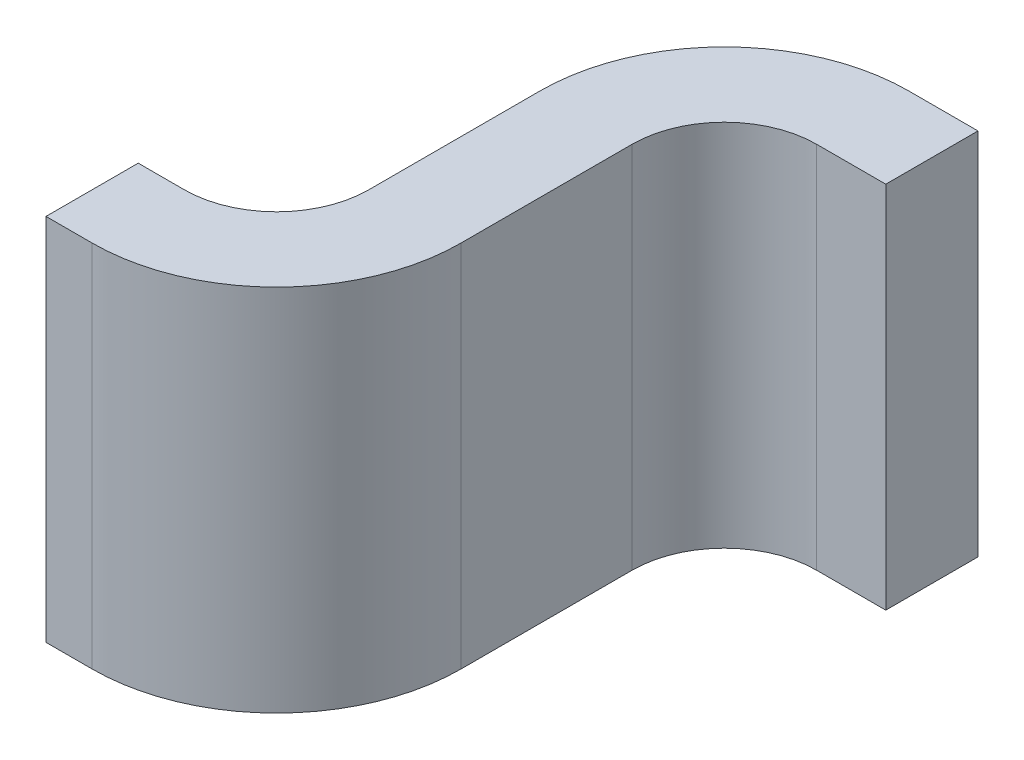
ISO-10303-21;
HEADER;
FILE_DESCRIPTION(('STEP AP214'),'2;1');
FILE_NAME('part.step','',(''),(''),'','','');
FILE_SCHEMA(('AUTOMOTIVE_DESIGN { 1 0 10303 214 1 1 1 1 }'));
ENDSEC;
DATA;
#1=APPLICATION_CONTEXT('core data for automotive mechanical design processes');
#2=APPLICATION_PROTOCOL_DEFINITION('international standard','automotive_design',2000,#1);
#3=PRODUCT_CONTEXT('',#1,'mechanical');
#4=PRODUCT('Part','Part','',(#3));
#5=PRODUCT_RELATED_PRODUCT_CATEGORY('part','',(#4));
#6=PRODUCT_DEFINITION_FORMATION('','',#4);
#7=PRODUCT_DEFINITION_CONTEXT('part definition',#1,'design');
#8=PRODUCT_DEFINITION('design','',#6,#7);
#9=PRODUCT_DEFINITION_SHAPE('','',#8);
#10=(LENGTH_UNIT() NAMED_UNIT(*) SI_UNIT(.MILLI.,.METRE.));
#11=(NAMED_UNIT(*) PLANE_ANGLE_UNIT() SI_UNIT($,.RADIAN.));
#12=(NAMED_UNIT(*) SI_UNIT($,.STERADIAN.) SOLID_ANGLE_UNIT());
#13=UNCERTAINTY_MEASURE_WITH_UNIT(LENGTH_MEASURE(1.E-05),#10,'distance_accuracy_value','');
#14=(GEOMETRIC_REPRESENTATION_CONTEXT(3) GLOBAL_UNCERTAINTY_ASSIGNED_CONTEXT((#13)) GLOBAL_UNIT_ASSIGNED_CONTEXT((#10,
#11,#12)) REPRESENTATION_CONTEXT('',''));
#15=CARTESIAN_POINT('',(0.,0.,0.));
#16=DIRECTION('',(0.,0.,1.));
#17=DIRECTION('',(1.,0.,0.));
#18=AXIS2_PLACEMENT_3D('',#15,#16,#17);
#19=CARTESIAN_POINT('',(9.95008326334,12.94991541666,-1.611602028607));
#20=DIRECTION('',(0.,8.74227765734797E-08,-0.999999999999996));
#21=DIRECTION('',(0.,0.999999999999996,8.74227765734797E-08));
#22=AXIS2_PLACEMENT_3D('',#19,#20,#21);
#23=PLANE('',#22);
#24=DIRECTION('',(1.,0.,0.));
#25=VECTOR('',#24,1.);
#26=CARTESIAN_POINT('',(9.95008326334,12.9499154166597,-1.611602028607));
#27=LINE('',#26,#25);
#28=CARTESIAN_POINT('',(9.90008326334,12.9499154166599,-1.61160200529433));
#29=VERTEX_POINT('',#28);
#30=CARTESIAN_POINT('',(9.95008326334,12.9499154166599,-1.611602028607));
#31=VERTEX_POINT('',#30);
#32=EDGE_CURVE('E156',#29,#31,#27,.T.);
#33=ORIENTED_EDGE('',*,*,#32,.T.);
#34=DIRECTION('',(0.,-0.999999999999996,-8.74227765734797E-08));
#35=VECTOR('',#34,1.);
#36=CARTESIAN_POINT('',(9.95008326334,12.9499154166604,-1.611602028607));
#37=LINE('',#36,#35);
#38=CARTESIAN_POINT('',(9.95008326334,13.3499154166602,-1.61160199363792));
#39=VERTEX_POINT('',#38);
#40=EDGE_CURVE('E91',#39,#31,#37,.T.);
#41=ORIENTED_EDGE('',*,*,#40,.F.);
#42=DIRECTION('',(1.,0.,0.));
#43=VECTOR('',#42,1.);
#44=CARTESIAN_POINT('',(9.95008326334,13.34991541666,-1.611601993638));
#45=LINE('',#44,#43);
#46=CARTESIAN_POINT('',(9.90008326334,13.34991541666,-1.611601993638));
#47=VERTEX_POINT('',#46);
#48=EDGE_CURVE('E139',#39,#47,#45,.F.);
#49=ORIENTED_EDGE('',*,*,#48,.T.);
#50=DIRECTION('',(0.,1.,0.));
#51=VECTOR('',#50,1.);
#52=CARTESIAN_POINT('',(9.90008326334,12.94991541666,-1.611601993638));
#53=LINE('',#52,#51);
#54=EDGE_CURVE('E142',#47,#29,#53,.F.);
#55=ORIENTED_EDGE('',*,*,#54,.T.);
#56=EDGE_LOOP('',(#33,#41,#49,#55));
#57=FACE_BOUND('',#56,.T.);
#58=ADVANCED_FACE('F17',(#57),#23,.F.);
#59=CARTESIAN_POINT('',(9.90008326334,12.94991541666,-1.611602028607));
#60=DIRECTION('',(1.,0.,0.));
#61=DIRECTION('',(0.,1.,0.));
#62=AXIS2_PLACEMENT_3D('',#59,#60,#61);
#63=PLANE('',#62);
#64=DIRECTION('',(0.,8.74227765734797E-08,-0.999999999999996));
#65=VECTOR('',#64,1.);
#66=CARTESIAN_POINT('',(9.90008326334,13.34991541666,-1.611601993638));
#67=LINE('',#66,#65);
#68=CARTESIAN_POINT('',(9.90008326334,13.3499154254021,-1.711601993638));
#69=VERTEX_POINT('',#68);
#70=EDGE_CURVE('E138',#47,#69,#67,.T.);
#71=ORIENTED_EDGE('',*,*,#70,.T.);
#72=DIRECTION('',(0.,-0.999999999999996,-8.74227765734797E-08));
#73=VECTOR('',#72,1.);
#74=CARTESIAN_POINT('',(9.90008326334,13.349915425402,-1.711601993638));
#75=LINE('',#74,#73);
#76=CARTESIAN_POINT('',(9.90008326334,12.949915421031,-1.71160202860711));
#77=VERTEX_POINT('',#76);
#78=EDGE_CURVE('E128',#69,#77,#75,.T.);
#79=ORIENTED_EDGE('',*,*,#78,.T.);
#80=DIRECTION('',(0.,0.,1.));
#81=VECTOR('',#80,1.);
#82=CARTESIAN_POINT('',(9.90008326334,12.94991541666,-1.611602028607));
#83=LINE('',#82,#81);
#84=EDGE_CURVE('E153',#29,#77,#83,.F.);
#85=ORIENTED_EDGE('',*,*,#84,.F.);
#86=ORIENTED_EDGE('',*,*,#54,.F.);
#87=EDGE_LOOP('',(#71,#79,#85,#86));
#88=FACE_BOUND('',#87,.T.);
#89=ADVANCED_FACE('F192',(#88),#63,.F.);
#90=CARTESIAN_POINT('',(9.95008326334,12.949915434145,-1.811602028607));
#91=DIRECTION('',(0.,-0.999999999999996,-8.74227765734797E-08));
#92=DIRECTION('',(0.,8.74227765734797E-08,-0.999999999999996));
#93=AXIS2_PLACEMENT_3D('',#90,#91,#92);
#94=CYLINDRICAL_SURFACE('',#93,0.2);
#95=CARTESIAN_POINT('',(9.95008326334,12.9499154341446,-1.811602028607));
#96=DIRECTION('',(0.,-0.999999999999996,-8.74227765734797E-08));
#97=DIRECTION('',(0.,8.74227765734797E-08,-0.999999999999996));
#98=AXIS2_PLACEMENT_3D('',#95,#96,#97);
#99=CIRCLE('',#98,0.2);
#100=CARTESIAN_POINT('',(10.15008326334,12.9499154341448,-1.811602028607));
#101=VERTEX_POINT('',#100);
#102=EDGE_CURVE('E20',#101,#31,#99,.T.);
#103=ORIENTED_EDGE('',*,*,#102,.F.);
#104=DIRECTION('',(0.,-1.,0.));
#105=VECTOR('',#104,1.);
#106=CARTESIAN_POINT('',(10.15008326334,12.949915450362,-1.811602028607));
#107=LINE('',#106,#105);
#108=CARTESIAN_POINT('',(10.15008326334,13.349915434145,-1.81160201112244));
#109=VERTEX_POINT('',#108);
#110=EDGE_CURVE('E89',#101,#109,#107,.F.);
#111=ORIENTED_EDGE('',*,*,#110,.T.);
#112=CARTESIAN_POINT('',(9.95008326334,13.349915434145,-1.81160199363789));
#113=DIRECTION('',(0.,-0.999999999999996,-8.74227765734797E-08));
#114=DIRECTION('',(0.,8.74227765734797E-08,-0.999999999999996));
#115=AXIS2_PLACEMENT_3D('',#112,#113,#114);
#116=CIRCLE('',#115,0.2);
#117=EDGE_CURVE('E103',#39,#109,#116,.F.);
#118=ORIENTED_EDGE('',*,*,#117,.F.);
#119=ORIENTED_EDGE('',*,*,#40,.T.);
#120=EDGE_LOOP('',(#103,#111,#118,#119));
#121=FACE_BOUND('',#120,.T.);
#122=ADVANCED_FACE('F87',(#121),#94,.T.);
#123=CARTESIAN_POINT('',(9.95008326334,13.349915425402,-1.711601993638));
#124=DIRECTION('',(0.,-8.74227765734797E-08,0.999999999999996));
#125=DIRECTION('',(0.,-0.999999999999996,-8.74227765734797E-08));
#126=AXIS2_PLACEMENT_3D('',#123,#124,#125);
#127=PLANE('',#126);
#128=DIRECTION('',(1.,0.,0.));
#129=VECTOR('',#128,1.);
#130=CARTESIAN_POINT('',(9.95008326334,13.349915425402,-1.711601993638));
#131=LINE('',#130,#129);
#132=CARTESIAN_POINT('',(9.95008326334,13.3499154254024,-1.711601993638));
#133=VERTEX_POINT('',#132);
#134=EDGE_CURVE('E125',#133,#69,#131,.F.);
#135=ORIENTED_EDGE('',*,*,#134,.F.);
#136=DIRECTION('',(0.,-0.999999999999996,-8.74227765734797E-08));
#137=VECTOR('',#136,1.);
#138=CARTESIAN_POINT('',(9.95008326334,13.3499154254027,-1.711601993638));
#139=LINE('',#138,#137);
#140=CARTESIAN_POINT('',(9.95008326334,12.9499154254022,-1.71160202860711));
#141=VERTEX_POINT('',#140);
#142=EDGE_CURVE('E131',#133,#141,#139,.T.);
#143=ORIENTED_EDGE('',*,*,#142,.T.);
#144=DIRECTION('',(1.,0.,0.));
#145=VECTOR('',#144,1.);
#146=CARTESIAN_POINT('',(9.95008326334,12.949915425402,-1.71160202860711));
#147=LINE('',#146,#145);
#148=EDGE_CURVE('E95',#77,#141,#147,.T.);
#149=ORIENTED_EDGE('',*,*,#148,.F.);
#150=ORIENTED_EDGE('',*,*,#78,.F.);
#151=EDGE_LOOP('',(#135,#143,#149,#150));
#152=FACE_BOUND('',#151,.T.);
#153=ADVANCED_FACE('F343',(#152),#127,.F.);
#154=CARTESIAN_POINT('',(10.15008326334,12.949915450362,-1.997102028607));
#155=DIRECTION('',(-1.,0.,0.));
#156=DIRECTION('',(0.,-1.,0.));
#157=AXIS2_PLACEMENT_3D('',#154,#155,#156);
#158=PLANE('',#157);
#159=DIRECTION('',(0.,-8.74227765734797E-08,0.999999999999996));
#160=VECTOR('',#159,1.);
#161=CARTESIAN_POINT('',(10.15008326334,12.949915450362,-1.997102028607));
#162=LINE('',#161,#160);
#163=CARTESIAN_POINT('',(10.15008326334,12.9499154503617,-1.997102028607));
#164=VERTEX_POINT('',#163);
#165=EDGE_CURVE('E98',#101,#164,#162,.F.);
#166=ORIENTED_EDGE('',*,*,#165,.T.);
#167=DIRECTION('',(0.,0.999999999999996,8.74227765734797E-08));
#168=VECTOR('',#167,1.);
#169=CARTESIAN_POINT('',(10.15008326334,12.949915450362,-1.997102028607));
#170=LINE('',#169,#168);
#171=CARTESIAN_POINT('',(10.15008326334,13.3499154503617,-1.99710199363792));
#172=VERTEX_POINT('',#171);
#173=EDGE_CURVE('E241',#164,#172,#170,.T.);
#174=ORIENTED_EDGE('',*,*,#173,.T.);
#175=DIRECTION('',(0.,8.74227765734797E-08,-0.999999999999996));
#176=VECTOR('',#175,1.);
#177=CARTESIAN_POINT('',(10.15008326334,13.349915450362,-1.997101993638));
#178=LINE('',#177,#176);
#179=EDGE_CURVE('E101',#172,#109,#178,.F.);
#180=ORIENTED_EDGE('',*,*,#179,.T.);
#181=ORIENTED_EDGE('',*,*,#110,.F.);
#182=EDGE_LOOP('',(#166,#174,#180,#181));
#183=FACE_BOUND('',#182,.T.);
#184=ADVANCED_FACE('F97',(#183),#158,.F.);
#185=CARTESIAN_POINT('',(10.32508326334,12.949915459104,-2.097102028607));
#186=DIRECTION('',(0.,8.74227765734797E-08,-0.999999999999996));
#187=DIRECTION('',(0.,0.999999999999996,8.74227765734797E-08));
#188=AXIS2_PLACEMENT_3D('',#185,#186,#187);
#189=PLANE('',#188);
#190=DIRECTION('',(1.,0.,0.));
#191=VECTOR('',#190,1.);
#192=CARTESIAN_POINT('',(10.32508326334,12.9499154591037,-2.097102028607));
#193=LINE('',#192,#191);
#194=CARTESIAN_POINT('',(10.25008326334,12.9499154591038,-2.097102028607));
#195=VERTEX_POINT('',#194);
#196=CARTESIAN_POINT('',(10.32508326334,12.9499154591039,-2.09710200529433));
#197=VERTEX_POINT('',#196);
#198=EDGE_CURVE('E235',#195,#197,#193,.T.);
#199=ORIENTED_EDGE('',*,*,#198,.T.);
#200=DIRECTION('',(0.,1.,0.));
#201=VECTOR('',#200,1.);
#202=CARTESIAN_POINT('',(10.32508326334,12.949915459104,-2.097101993638));
#203=LINE('',#202,#201);
#204=CARTESIAN_POINT('',(10.32508326334,13.349915462018,-2.097101993638));
#205=VERTEX_POINT('',#204);
#206=EDGE_CURVE('E118',#205,#197,#203,.F.);
#207=ORIENTED_EDGE('',*,*,#206,.F.);
#208=DIRECTION('',(1.,0.,0.));
#209=VECTOR('',#208,1.);
#210=CARTESIAN_POINT('',(10.32508326334,13.349915459104,-2.097101993638));
#211=LINE('',#210,#209);
#212=CARTESIAN_POINT('',(10.25008326334,13.349915459104,-2.09710199363795));
#213=VERTEX_POINT('',#212);
#214=EDGE_CURVE('E180',#205,#213,#211,.F.);
#215=ORIENTED_EDGE('',*,*,#214,.T.);
#216=DIRECTION('',(0.,0.999999999999996,8.74227765734797E-08));
#217=VECTOR('',#216,1.);
#218=CARTESIAN_POINT('',(10.25008326334,12.9499154591043,-2.097102028607));
#219=LINE('',#218,#217);
#220=EDGE_CURVE('E243',#213,#195,#219,.F.);
#221=ORIENTED_EDGE('',*,*,#220,.T.);
#222=EDGE_LOOP('',(#199,#207,#215,#221));
#223=FACE_BOUND('',#222,.T.);
#224=ADVANCED_FACE('F248',(#223),#189,.F.);
#225=CARTESIAN_POINT('',(9.95008326334,13.349915434145,-1.811601993638));
#226=DIRECTION('',(0.,-0.999999999999996,-8.74227765734797E-08));
#227=DIRECTION('',(0.,8.74227765734797E-08,-0.999999999999996));
#228=AXIS2_PLACEMENT_3D('',#225,#226,#227);
#229=CYLINDRICAL_SURFACE('',#228,0.1);
#230=CARTESIAN_POINT('',(9.95008326334,13.349915434145,-1.811601993638));
#231=DIRECTION('',(0.,-0.999999999999996,-8.74227765734797E-08));
#232=DIRECTION('',(0.,8.74227765734797E-08,-0.999999999999996));
#233=AXIS2_PLACEMENT_3D('',#230,#231,#232);
#234=CIRCLE('',#233,0.1);
#235=CARTESIAN_POINT('',(10.05008326334,13.3499154422535,-1.811601993638));
#236=VERTEX_POINT('',#235);
#237=EDGE_CURVE('E112',#236,#133,#234,.T.);
#238=ORIENTED_EDGE('',*,*,#237,.F.);
#239=DIRECTION('',(0.,1.,0.));
#240=VECTOR('',#239,1.);
#241=CARTESIAN_POINT('',(10.05008326334,13.349915450362,-1.811601993638));
#242=LINE('',#241,#240);
#243=CARTESIAN_POINT('',(10.05008326334,12.9499154341443,-1.81160201112256));
#244=VERTEX_POINT('',#243);
#245=EDGE_CURVE('E177',#236,#244,#242,.F.);
#246=ORIENTED_EDGE('',*,*,#245,.T.);
#247=CARTESIAN_POINT('',(9.95008326334,12.9499154341443,-1.81160202860711));
#248=DIRECTION('',(0.,-0.999999999999996,-8.74227765734797E-08));
#249=DIRECTION('',(0.,8.74227765734797E-08,-0.999999999999996));
#250=AXIS2_PLACEMENT_3D('',#247,#248,#249);
#251=CIRCLE('',#250,0.1);
#252=EDGE_CURVE('E110',#141,#244,#251,.F.);
#253=ORIENTED_EDGE('',*,*,#252,.F.);
#254=ORIENTED_EDGE('',*,*,#142,.F.);
#255=EDGE_LOOP('',(#238,#246,#253,#254));
#256=FACE_BOUND('',#255,.T.);
#257=ADVANCED_FACE('F260',(#256),#229,.F.);
#258=CARTESIAN_POINT('',(10.25008326334,12.949915450362,-1.997102028607));
#259=DIRECTION('',(0.,0.999999999999996,8.74227765734797E-08));
#260=DIRECTION('',(0.,-8.74227765734797E-08,0.999999999999996));
#261=AXIS2_PLACEMENT_3D('',#258,#259,#260);
#262=CYLINDRICAL_SURFACE('',#261,0.1);
#263=CARTESIAN_POINT('',(10.25008326334,12.9499154503617,-1.997102028607));
#264=DIRECTION('',(0.,0.999999999999996,8.74227765734797E-08));
#265=DIRECTION('',(0.,-8.74227765734797E-08,0.999999999999996));
#266=AXIS2_PLACEMENT_3D('',#263,#264,#265);
#267=CIRCLE('',#266,0.1);
#268=EDGE_CURVE('E109',#195,#164,#267,.T.);
#269=ORIENTED_EDGE('',*,*,#268,.F.);
#270=ORIENTED_EDGE('',*,*,#220,.F.);
#271=CARTESIAN_POINT('',(10.25008326334,13.349915450362,-1.99710199363789));
#272=DIRECTION('',(0.,0.999999999999996,8.74227765734797E-08));
#273=DIRECTION('',(0.,-8.74227765734797E-08,0.999999999999996));
#274=AXIS2_PLACEMENT_3D('',#271,#272,#273);
#275=CIRCLE('',#274,0.1);
#276=EDGE_CURVE('E173',#172,#213,#275,.F.);
#277=ORIENTED_EDGE('',*,*,#276,.F.);
#278=ORIENTED_EDGE('',*,*,#173,.F.);
#279=EDGE_LOOP('',(#269,#270,#277,#278));
#280=FACE_BOUND('',#279,.T.);
#281=ADVANCED_FACE('F309',(#280),#262,.F.);
#282=CARTESIAN_POINT('',(10.32508326334,12.949915459104,-2.097102028607));
#283=DIRECTION('',(1.,0.,0.));
#284=DIRECTION('',(0.,1.,0.));
#285=AXIS2_PLACEMENT_3D('',#282,#283,#284);
#286=PLANE('',#285);
#287=DIRECTION('',(0.,8.74227765734797E-08,-0.999999999999996));
#288=VECTOR('',#287,1.);
#289=CARTESIAN_POINT('',(10.32508326334,13.349915459104,-2.097101993638));
#290=LINE('',#289,#288);
#291=CARTESIAN_POINT('',(10.32508326334,13.3499154678461,-2.197101993638));
#292=VERTEX_POINT('',#291);
#293=EDGE_CURVE('E121',#292,#205,#290,.F.);
#294=ORIENTED_EDGE('',*,*,#293,.T.);
#295=ORIENTED_EDGE('',*,*,#206,.T.);
#296=DIRECTION('',(0.,0.,1.));
#297=VECTOR('',#296,1.);
#298=CARTESIAN_POINT('',(10.32508326334,12.949915459104,-2.097102028607));
#299=LINE('',#298,#297);
#300=CARTESIAN_POINT('',(10.32508326334,12.949915464932,-2.19710202860711));
#301=VERTEX_POINT('',#300);
#302=EDGE_CURVE('E122',#197,#301,#299,.F.);
#303=ORIENTED_EDGE('',*,*,#302,.T.);
#304=DIRECTION('',(0.,-0.999999999999996,-8.74227765734797E-08));
#305=VECTOR('',#304,1.);
#306=CARTESIAN_POINT('',(10.32508326334,13.349915467846,-2.197101993638));
#307=LINE('',#306,#305);
#308=EDGE_CURVE('E210',#301,#292,#307,.F.);
#309=ORIENTED_EDGE('',*,*,#308,.T.);
#310=EDGE_LOOP('',(#294,#295,#303,#309));
#311=FACE_BOUND('',#310,.T.);
#312=ADVANCED_FACE('F211',(#311),#286,.T.);
#313=CARTESIAN_POINT('',(10.144017246162,12.949915459634,-2.103168045785));
#314=DIRECTION('',(0.,-0.999999999999996,-8.74227765734797E-08));
#315=DIRECTION('',(0.,8.74227765734797E-08,-0.999999999999996));
#316=AXIS2_PLACEMENT_3D('',#313,#314,#315);
#317=PLANE('',#316);
#318=CARTESIAN_POINT('',(10.25008326334,12.9499154503614,-1.99710202860711));
#319=DIRECTION('',(0.,0.999999999999996,8.74227765734797E-08));
#320=DIRECTION('',(0.,-8.74227765734797E-08,0.999999999999996));
#321=AXIS2_PLACEMENT_3D('',#318,#319,#320);
#322=CIRCLE('',#321,0.2);
#323=CARTESIAN_POINT('',(10.25008326334,12.949915467846,-2.19710202860711));
#324=VERTEX_POINT('',#323);
#325=CARTESIAN_POINT('',(10.05008326334,12.9499154422532,-1.997102028607));
#326=VERTEX_POINT('',#325);
#327=EDGE_CURVE('E170',#324,#326,#322,.T.);
#328=ORIENTED_EDGE('',*,*,#327,.F.);
#329=DIRECTION('',(1.,0.,0.));
#330=VECTOR('',#329,1.);
#331=CARTESIAN_POINT('',(10.32508326334,12.949915467846,-2.19710202860711));
#332=LINE('',#331,#330);
#333=EDGE_CURVE('E176',#324,#301,#332,.T.);
#334=ORIENTED_EDGE('',*,*,#333,.T.);
#335=ORIENTED_EDGE('',*,*,#302,.F.);
#336=ORIENTED_EDGE('',*,*,#198,.F.);
#337=ORIENTED_EDGE('',*,*,#268,.T.);
#338=ORIENTED_EDGE('',*,*,#165,.F.);
#339=ORIENTED_EDGE('',*,*,#102,.T.);
#340=ORIENTED_EDGE('',*,*,#32,.F.);
#341=ORIENTED_EDGE('',*,*,#84,.T.);
#342=ORIENTED_EDGE('',*,*,#148,.T.);
#343=ORIENTED_EDGE('',*,*,#252,.T.);
#344=DIRECTION('',(0.,0.,1.));
#345=VECTOR('',#344,1.);
#346=CARTESIAN_POINT('',(10.05008326334,12.949915434145,-1.997101993638));
#347=LINE('',#346,#345);
#348=EDGE_CURVE('E179',#244,#326,#347,.F.);
#349=ORIENTED_EDGE('',*,*,#348,.T.);
#350=EDGE_LOOP('',(#328,#334,#335,#336,#337,#338,#339,#340,#341,#342,#343,#349));
#351=FACE_BOUND('',#350,.T.);
#352=ADVANCED_FACE('F106',(#351),#317,.T.);
#353=CARTESIAN_POINT('',(10.05008326334,13.349915450362,-1.997101993638));
#354=DIRECTION('',(1.,0.,0.));
#355=DIRECTION('',(0.,1.,0.));
#356=AXIS2_PLACEMENT_3D('',#353,#354,#355);
#357=PLANE('',#356);
#358=DIRECTION('',(0.,0.,1.));
#359=VECTOR('',#358,1.);
#360=CARTESIAN_POINT('',(10.05008326334,13.349915450362,-1.997101993638));
#361=LINE('',#360,#359);
#362=CARTESIAN_POINT('',(10.05008326334,13.349915450362,-1.99710201112244));
#363=VERTEX_POINT('',#362);
#364=EDGE_CURVE('E224',#363,#236,#361,.T.);
#365=ORIENTED_EDGE('',*,*,#364,.F.);
#366=DIRECTION('',(0.,0.999999999999996,8.74227765734797E-08));
#367=VECTOR('',#366,1.);
#368=CARTESIAN_POINT('',(10.05008326334,13.349915450362,-1.99710199363789));
#369=LINE('',#368,#367);
#370=EDGE_CURVE('E169',#326,#363,#369,.T.);
#371=ORIENTED_EDGE('',*,*,#370,.F.);
#372=ORIENTED_EDGE('',*,*,#348,.F.);
#373=ORIENTED_EDGE('',*,*,#245,.F.);
#374=EDGE_LOOP('',(#365,#371,#372,#373));
#375=FACE_BOUND('',#374,.T.);
#376=ADVANCED_FACE('F263',(#375),#357,.F.);
#377=CARTESIAN_POINT('',(10.144017246162,13.349915459634,-2.103168010816));
#378=DIRECTION('',(0.,0.999999999999996,8.74227765734797E-08));
#379=DIRECTION('',(0.,-8.74227765734797E-08,0.999999999999996));
#380=AXIS2_PLACEMENT_3D('',#377,#378,#379);
#381=PLANE('',#380);
#382=ORIENTED_EDGE('',*,*,#276,.T.);
#383=ORIENTED_EDGE('',*,*,#214,.F.);
#384=ORIENTED_EDGE('',*,*,#293,.F.);
#385=DIRECTION('',(1.,0.,0.));
#386=VECTOR('',#385,1.);
#387=CARTESIAN_POINT('',(10.32508326334,13.349915467846,-2.197101993638));
#388=LINE('',#387,#386);
#389=CARTESIAN_POINT('',(10.25008326334,13.3499154678463,-2.197101993638));
#390=VERTEX_POINT('',#389);
#391=EDGE_CURVE('E35',#292,#390,#388,.F.);
#392=ORIENTED_EDGE('',*,*,#391,.T.);
#393=CARTESIAN_POINT('',(10.25008326334,13.349915450362,-1.997101993638));
#394=DIRECTION('',(0.,0.999999999999996,8.74227765734797E-08));
#395=DIRECTION('',(0.,-8.74227765734797E-08,0.999999999999996));
#396=AXIS2_PLACEMENT_3D('',#393,#394,#395);
#397=CIRCLE('',#396,0.2);
#398=EDGE_CURVE('E26',#363,#390,#397,.F.);
#399=ORIENTED_EDGE('',*,*,#398,.F.);
#400=ORIENTED_EDGE('',*,*,#364,.T.);
#401=ORIENTED_EDGE('',*,*,#237,.T.);
#402=ORIENTED_EDGE('',*,*,#134,.T.);
#403=ORIENTED_EDGE('',*,*,#70,.F.);
#404=ORIENTED_EDGE('',*,*,#48,.F.);
#405=ORIENTED_EDGE('',*,*,#117,.T.);
#406=ORIENTED_EDGE('',*,*,#179,.F.);
#407=EDGE_LOOP('',(#382,#383,#384,#392,#399,#400,#401,#402,#403,#404,#405,#406));
#408=FACE_BOUND('',#407,.T.);
#409=ADVANCED_FACE('F182',(#408),#381,.T.);
#410=CARTESIAN_POINT('',(10.32508326334,13.349915467846,-2.197101993638));
#411=DIRECTION('',(0.,-8.74227765734797E-08,0.999999999999996));
#412=DIRECTION('',(0.,-0.999999999999996,-8.74227765734797E-08));
#413=AXIS2_PLACEMENT_3D('',#410,#411,#412);
#414=PLANE('',#413);
#415=ORIENTED_EDGE('',*,*,#391,.F.);
#416=ORIENTED_EDGE('',*,*,#308,.F.);
#417=ORIENTED_EDGE('',*,*,#333,.F.);
#418=DIRECTION('',(0.,0.999999999999996,8.74227765734797E-08));
#419=VECTOR('',#418,1.);
#420=CARTESIAN_POINT('',(10.25008326334,13.3499154678466,-2.197101993638));
#421=LINE('',#420,#419);
#422=EDGE_CURVE('E11',#390,#324,#421,.F.);
#423=ORIENTED_EDGE('',*,*,#422,.F.);
#424=EDGE_LOOP('',(#415,#416,#417,#423));
#425=FACE_BOUND('',#424,.T.);
#426=ADVANCED_FACE('F218',(#425),#414,.F.);
#427=CARTESIAN_POINT('',(10.25008326334,13.349915450362,-1.997101993638));
#428=DIRECTION('',(0.,0.999999999999996,8.74227765734797E-08));
#429=DIRECTION('',(0.,-8.74227765734797E-08,0.999999999999996));
#430=AXIS2_PLACEMENT_3D('',#427,#428,#429);
#431=CYLINDRICAL_SURFACE('',#430,0.2);
#432=ORIENTED_EDGE('',*,*,#398,.T.);
#433=ORIENTED_EDGE('',*,*,#422,.T.);
#434=ORIENTED_EDGE('',*,*,#327,.T.);
#435=ORIENTED_EDGE('',*,*,#370,.T.);
#436=EDGE_LOOP('',(#432,#433,#434,#435));
#437=FACE_BOUND('',#436,.T.);
#438=ADVANCED_FACE('F251',(#437),#431,.T.);
#439=CLOSED_SHELL('',(#58,#89,#122,#153,#184,#224,#257,#281,#312,#352,#376,#409,#426,#438));
#440=MANIFOLD_SOLID_BREP('B1',#439);
#441=ADVANCED_BREP_SHAPE_REPRESENTATION('',(#18,#440),#14);
#442=SHAPE_DEFINITION_REPRESENTATION(#9,#441);
ENDSEC;
END-ISO-10303-21;
